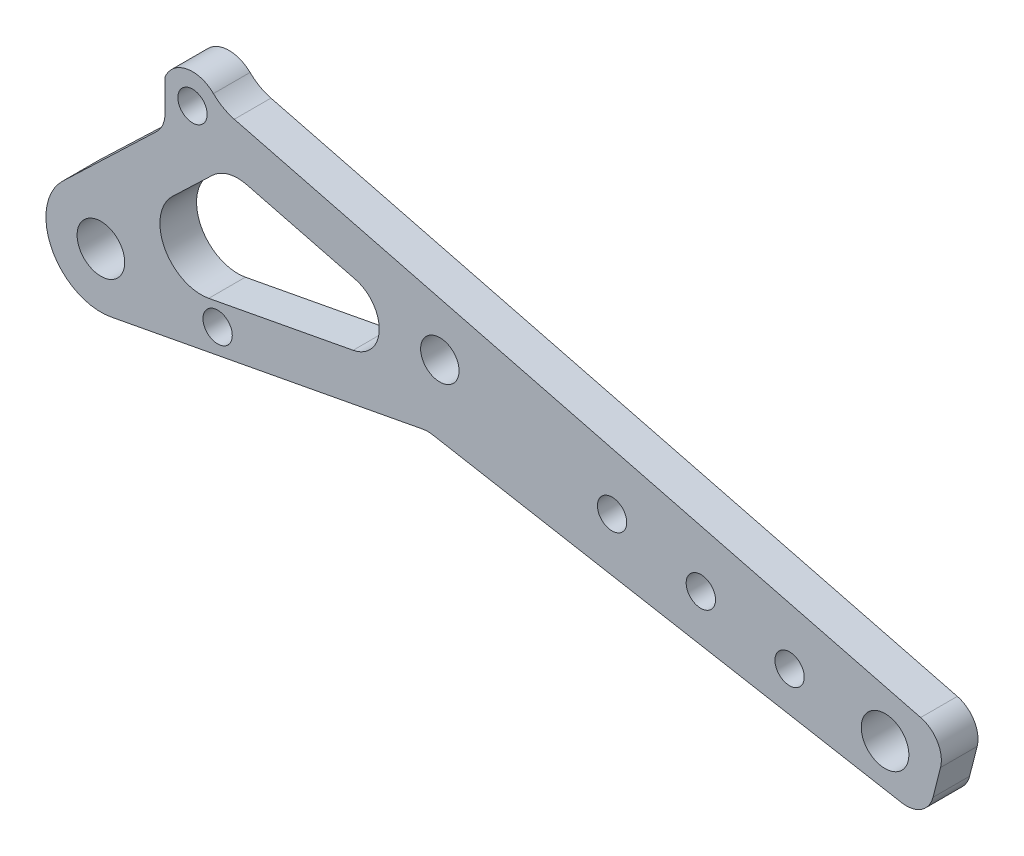
ISO-10303-21;
HEADER;
FILE_DESCRIPTION(('STEP AP214'),'2;1');
FILE_NAME('part.step','',(''),(''),'','','');
FILE_SCHEMA(('AUTOMOTIVE_DESIGN { 1 0 10303 214 1 1 1 1 }'));
ENDSEC;
DATA;
#1=APPLICATION_CONTEXT('core data for automotive mechanical design processes');
#2=APPLICATION_PROTOCOL_DEFINITION('international standard','automotive_design',2000,#1);
#3=PRODUCT_CONTEXT('',#1,'mechanical');
#4=PRODUCT('Part','Part','',(#3));
#5=PRODUCT_RELATED_PRODUCT_CATEGORY('part','',(#4));
#6=PRODUCT_DEFINITION_FORMATION('','',#4);
#7=PRODUCT_DEFINITION_CONTEXT('part definition',#1,'design');
#8=PRODUCT_DEFINITION('design','',#6,#7);
#9=PRODUCT_DEFINITION_SHAPE('','',#8);
#10=(LENGTH_UNIT() NAMED_UNIT(*) SI_UNIT(.MILLI.,.METRE.));
#11=(NAMED_UNIT(*) PLANE_ANGLE_UNIT() SI_UNIT($,.RADIAN.));
#12=(NAMED_UNIT(*) SI_UNIT($,.STERADIAN.) SOLID_ANGLE_UNIT());
#13=UNCERTAINTY_MEASURE_WITH_UNIT(LENGTH_MEASURE(1.E-05),#10,'distance_accuracy_value','');
#14=(GEOMETRIC_REPRESENTATION_CONTEXT(3) GLOBAL_UNCERTAINTY_ASSIGNED_CONTEXT((#13)) GLOBAL_UNIT_ASSIGNED_CONTEXT((#10,
#11,#12)) REPRESENTATION_CONTEXT('',''));
#15=CARTESIAN_POINT('',(0.,0.,0.));
#16=DIRECTION('',(0.,0.,1.));
#17=DIRECTION('',(1.,0.,0.));
#18=AXIS2_PLACEMENT_3D('',#15,#16,#17);
#19=CARTESIAN_POINT('',(0.,0.,4.));
#20=DIRECTION('',(0.,0.,1.));
#21=DIRECTION('',(1.,0.,0.));
#22=AXIS2_PLACEMENT_3D('',#19,#20,#21);
#23=PLANE('',#22);
#24=CARTESIAN_POINT('',(-24.2579290742876,-9.0246929471557,4.));
#25=DIRECTION('',(0.,0.,1.));
#26=DIRECTION('',(1.,0.,0.));
#27=AXIS2_PLACEMENT_3D('',#24,#25,#26);
#28=CIRCLE('',#27,1.6);
#29=CARTESIAN_POINT('',(-22.6579290742876,-9.0246929471557,4.));
#30=VERTEX_POINT('',#29);
#31=EDGE_CURVE('E697',#30,#30,#28,.T.);
#32=ORIENTED_EDGE('',*,*,#31,.F.);
#33=EDGE_LOOP('',(#32));
#34=FACE_BOUND('',#33,.T.);
#35=CARTESIAN_POINT('',(48.605919829375,-11.7412498607445,4.));
#36=DIRECTION('',(0.,0.,1.));
#37=DIRECTION('',(1.,0.,0.));
#38=AXIS2_PLACEMENT_3D('',#35,#36,#37);
#39=CIRCLE('',#38,2.6);
#40=CARTESIAN_POINT('',(51.205919829375,-11.7412498607445,4.));
#41=VERTEX_POINT('',#40);
#42=EDGE_CURVE('E206',#41,#41,#39,.T.);
#43=ORIENTED_EDGE('',*,*,#42,.F.);
#44=EDGE_LOOP('',(#43));
#45=FACE_BOUND('',#44,.T.);
#46=CARTESIAN_POINT('',(-10.1109774104164,-0.388566041352794,4.));
#47=DIRECTION('',(0.,0.,-1.));
#48=DIRECTION('',(1.,0.,0.));
#49=AXIS2_PLACEMENT_3D('',#46,#47,#48);
#50=CIRCLE('',#49,3.5);
#51=CARTESIAN_POINT('',(-9.24659939315065,3.0030192285863,4.));
#52=VERTEX_POINT('',#51);
#53=CARTESIAN_POINT('',(-9.46278783560658,-3.82802098001792,4.));
#54=VERTEX_POINT('',#53);
#55=EDGE_CURVE('E180',#52,#54,#50,.T.);
#56=ORIENTED_EDGE('',*,*,#55,.T.);
#57=DIRECTION('',(-0.982701411047179,-0.185197021374221,0.));
#58=VECTOR('',#57,1.);
#59=CARTESIAN_POINT('',(-9.46278783560658,-3.82802098001792,4.));
#60=LINE('',#59,#58);
#61=CARTESIAN_POINT('',(-25.2250618145575,-6.79853283455515,4.));
#62=VERTEX_POINT('',#61);
#63=EDGE_CURVE('E192',#54,#62,#60,.T.);
#64=ORIENTED_EDGE('',*,*,#63,.T.);
#65=CARTESIAN_POINT('',(-26.0584484107415,-2.37637648484284,4.));
#66=DIRECTION('',(0.,0.,-1.));
#67=DIRECTION('',(1.,0.,0.));
#68=AXIS2_PLACEMENT_3D('',#65,#66,#67);
#69=CIRCLE('',#68,4.5);
#70=CARTESIAN_POINT('',(-29.1691757168968,0.875296258029632,4.));
#71=VERTEX_POINT('',#70);
#72=EDGE_CURVE('E196',#62,#71,#69,.T.);
#73=ORIENTED_EDGE('',*,*,#72,.T.);
#74=DIRECTION('',(0.72259394286055,0.691272734701177,0.));
#75=VECTOR('',#74,1.);
#76=CARTESIAN_POINT('',(-24.8250370023878,5.03113603328696,4.));
#77=LINE('',#76,#75);
#78=CARTESIAN_POINT('',(-24.8250370023878,5.03113603328696,4.));
#79=VERTEX_POINT('',#78);
#80=EDGE_CURVE('E210',#71,#79,#77,.T.);
#81=ORIENTED_EDGE('',*,*,#80,.T.);
#82=CARTESIAN_POINT('',(-22.0599460635831,2.14076026184476,4.));
#83=DIRECTION('',(0.,0.,-1.));
#84=DIRECTION('',(-1.,0.,0.));
#85=AXIS2_PLACEMENT_3D('',#82,#83,#84);
#86=CIRCLE('',#85,4.);
#87=CARTESIAN_POINT('',(-21.0720854724223,6.01685771320372,4.));
#88=VERTEX_POINT('',#87);
#89=EDGE_CURVE('E213',#79,#88,#86,.T.);
#90=ORIENTED_EDGE('',*,*,#89,.T.);
#91=DIRECTION('',(0.96902436283974,-0.2469651477902,0.));
#92=VECTOR('',#91,1.);
#93=CARTESIAN_POINT('',(-9.24659939315065,3.0030192285863,4.));
#94=LINE('',#93,#92);
#95=EDGE_CURVE('E188',#88,#52,#94,.T.);
#96=ORIENTED_EDGE('',*,*,#95,.T.);
#97=EDGE_LOOP('',(#56,#64,#73,#81,#90,#96));
#98=FACE_BOUND('',#97,.T.);
#99=DIRECTION('',(0.984295601925326,-0.176528094167641,0.));
#100=VECTOR('',#99,1.);
#101=CARTESIAN_POINT('',(-1.32396070625731,-7.38221701443995,4.));
#102=LINE('',#101,#100);
#103=CARTESIAN_POINT('',(-0.780933282241435,-7.47960604681475,4.));
#104=VERTEX_POINT('',#103);
#105=CARTESIAN_POINT('',(50.3998489295503,-16.65860260454,4.));
#106=VERTEX_POINT('',#105);
#107=EDGE_CURVE('E321',#104,#106,#102,.T.);
#108=ORIENTED_EDGE('',*,*,#107,.T.);
#109=CARTESIAN_POINT('',(50.9294332120532,-13.7057157987641,4.));
#110=DIRECTION('',(0.,0.,1.));
#111=DIRECTION('',(1.,0.,0.));
#112=AXIS2_PLACEMENT_3D('',#109,#110,#111);
#113=CIRCLE('',#112,3.);
#114=CARTESIAN_POINT('',(53.8365063005724,-14.4466112421347,4.));
#115=VERTEX_POINT('',#114);
#116=EDGE_CURVE('E50',#106,#115,#113,.T.);
#117=ORIENTED_EDGE('',*,*,#116,.T.);
#118=DIRECTION('',(-0.2469651477902,-0.969024362839741,0.));
#119=VECTOR('',#118,1.);
#120=CARTESIAN_POINT('',(55.7701911815471,-6.85935540265431,4.));
#121=LINE('',#120,#119);
#122=CARTESIAN_POINT('',(54.6588480164912,-11.2199650354331,4.));
#123=VERTEX_POINT('',#122);
#124=EDGE_CURVE('E271',#123,#115,#121,.T.);
#125=ORIENTED_EDGE('',*,*,#124,.F.);
#126=CARTESIAN_POINT('',(51.751774927972,-10.4790695920625,4.));
#127=DIRECTION('',(0.,0.,1.));
#128=DIRECTION('',(1.,0.,0.));
#129=AXIS2_PLACEMENT_3D('',#126,#127,#128);
#130=CIRCLE('',#129,3.);
#131=CARTESIAN_POINT('',(52.4926703713426,-7.57199650354331,4.));
#132=VERTEX_POINT('',#131);
#133=EDGE_CURVE('E57',#123,#132,#130,.T.);
#134=ORIENTED_EDGE('',*,*,#133,.T.);
#135=DIRECTION('',(-0.96902436283974,0.2469651477902,0.));
#136=VECTOR('',#135,1.);
#137=CARTESIAN_POINT('',(59.9786379551097,-9.47986710161563,4.));
#138=LINE('',#137,#136);
#139=CARTESIAN_POINT('',(-22.4376172210398,11.5247055597415,4.));
#140=VERTEX_POINT('',#139);
#141=EDGE_CURVE('E240',#132,#140,#138,.T.);
#142=ORIENTED_EDGE('',*,*,#141,.T.);
#143=CARTESIAN_POINT('',(-21.2027914820888,16.3698273739402,4.));
#144=DIRECTION('',(0.,0.,-1.));
#145=DIRECTION('',(-1.,0.,0.));
#146=AXIS2_PLACEMENT_3D('',#143,#144,#145);
#147=CIRCLE('',#146,5.);
#148=CARTESIAN_POINT('',(-24.7162511899138,12.8123562382189,4.));
#149=VERTEX_POINT('',#148);
#150=EDGE_CURVE('E237',#140,#149,#147,.T.);
#151=ORIENTED_EDGE('',*,*,#150,.T.);
#152=CARTESIAN_POINT('',(-27.,10.5,4.));
#153=DIRECTION('',(0.,0.,-1.));
#154=DIRECTION('',(1.,0.,0.));
#155=AXIS2_PLACEMENT_3D('',#152,#153,#154);
#156=CIRCLE('',#155,3.25);
#157=CARTESIAN_POINT('',(-30.,11.75,4.));
#158=VERTEX_POINT('',#157);
#159=EDGE_CURVE('E300',#158,#149,#156,.T.);
#160=ORIENTED_EDGE('',*,*,#159,.F.);
#161=DIRECTION('',(0.,-1.,0.));
#162=VECTOR('',#161,1.);
#163=CARTESIAN_POINT('',(-30.,15.,4.));
#164=LINE('',#163,#162);
#165=CARTESIAN_POINT('',(-30.,8.28174586162454,4.));
#166=VERTEX_POINT('',#165);
#167=EDGE_CURVE('E319',#158,#166,#164,.T.);
#168=ORIENTED_EDGE('',*,*,#167,.T.);
#169=CARTESIAN_POINT('',(-33.,8.28174586162454,4.));
#170=DIRECTION('',(0.,0.,1.));
#171=DIRECTION('',(1.,0.,0.));
#172=AXIS2_PLACEMENT_3D('',#169,#170,#171);
#173=CIRCLE('',#172,3.);
#174=CARTESIAN_POINT('',(-30.9261817958965,6.11396403304289,4.));
#175=VERTEX_POINT('',#174);
#176=EDGE_CURVE('E343',#166,#175,#173,.F.);
#177=ORIENTED_EDGE('',*,*,#176,.T.);
#178=DIRECTION('',(-0.72259394286055,-0.691272734701178,0.));
#179=VECTOR('',#178,1.);
#180=CARTESIAN_POINT('',(-17.8323062489554,18.6402787726028,4.));
#181=LINE('',#180,#179);
#182=CARTESIAN_POINT('',(-41.1476364082071,-3.6644363428367,4.));
#183=VERTEX_POINT('',#182);
#184=EDGE_CURVE('E291',#175,#183,#181,.T.);
#185=ORIENTED_EDGE('',*,*,#184,.T.);
#186=CARTESIAN_POINT('',(-37.,-8.,4.));
#187=DIRECTION('',(0.,0.,1.));
#188=DIRECTION('',(1.,0.,0.));
#189=AXIS2_PLACEMENT_3D('',#186,#187,#188);
#190=CIRCLE('',#189,6.);
#191=CARTESIAN_POINT('',(-35.8888178717547,-13.8962084662831,4.));
#192=VERTEX_POINT('',#191);
#193=EDGE_CURVE('E293',#183,#192,#190,.T.);
#194=ORIENTED_EDGE('',*,*,#193,.T.);
#195=DIRECTION('',(-0.982701411047179,-0.185197021374221,0.));
#196=VECTOR('',#195,1.);
#197=CARTESIAN_POINT('',(1.29810546319708,-6.8880701261073,4.));
#198=LINE('',#197,#196);
#199=CARTESIAN_POINT('',(-1.86610862886702,-7.4843886194492,4.));
#200=VERTEX_POINT('',#199);
#201=EDGE_CURVE('E281',#200,#192,#198,.T.);
#202=ORIENTED_EDGE('',*,*,#201,.F.);
#203=CARTESIAN_POINT('',(-1.31051756474436,-10.4324928525907,4.));
#204=DIRECTION('',(0.,0.,1.));
#205=DIRECTION('',(1.,0.,0.));
#206=AXIS2_PLACEMENT_3D('',#203,#204,#205);
#207=CIRCLE('',#206,3.);
#208=EDGE_CURVE('E341',#200,#104,#207,.F.);
#209=ORIENTED_EDGE('',*,*,#208,.T.);
#210=EDGE_LOOP('',(#108,#117,#125,#134,#142,#151,#160,#168,#177,#185,#194,#202,#209));
#211=FACE_BOUND('',#210,.T.);
#212=CARTESIAN_POINT('',(-37.,-8.,4.));
#213=DIRECTION('',(0.,0.,1.));
#214=DIRECTION('',(1.,0.,0.));
#215=AXIS2_PLACEMENT_3D('',#212,#213,#214);
#216=CIRCLE('',#215,2.6);
#217=CARTESIAN_POINT('',(-34.4,-8.,4.));
#218=VERTEX_POINT('',#217);
#219=EDGE_CURVE('E274',#218,#218,#216,.T.);
#220=ORIENTED_EDGE('',*,*,#219,.F.);
#221=EDGE_LOOP('',(#220));
#222=FACE_BOUND('',#221,.T.);
#223=CARTESIAN_POINT('',(0.,0.,4.));
#224=DIRECTION('',(0.,0.,1.));
#225=DIRECTION('',(1.,0.,0.));
#226=AXIS2_PLACEMENT_3D('',#223,#224,#225);
#227=CIRCLE('',#226,2.1);
#228=CARTESIAN_POINT('',(2.1,0.,4.));
#229=VERTEX_POINT('',#228);
#230=EDGE_CURVE('E313',#229,#229,#227,.T.);
#231=ORIENTED_EDGE('',*,*,#230,.F.);
#232=EDGE_LOOP('',(#231));
#233=FACE_BOUND('',#232,.T.);
#234=CARTESIAN_POINT('',(28.4939552433701,-7.64748869388513,4.));
#235=DIRECTION('',(0.,0.,-1.));
#236=DIRECTION('',(-1.,0.,0.));
#237=AXIS2_PLACEMENT_3D('',#234,#235,#236);
#238=CIRCLE('',#237,1.6);
#239=CARTESIAN_POINT('',(26.8939552433701,-7.64748869388513,4.));
#240=VERTEX_POINT('',#239);
#241=EDGE_CURVE('E266',#240,#240,#238,.T.);
#242=ORIENTED_EDGE('',*,*,#241,.T.);
#243=EDGE_LOOP('',(#242));
#244=FACE_BOUND('',#243,.T.);
#245=CARTESIAN_POINT('',(18.8037116149727,-5.17783721598313,4.));
#246=DIRECTION('',(0.,0.,-1.));
#247=DIRECTION('',(-1.,0.,0.));
#248=AXIS2_PLACEMENT_3D('',#245,#246,#247);
#249=CIRCLE('',#248,1.6);
#250=CARTESIAN_POINT('',(17.2037116149727,-5.17783721598313,4.));
#251=VERTEX_POINT('',#250);
#252=EDGE_CURVE('E260',#251,#251,#249,.T.);
#253=ORIENTED_EDGE('',*,*,#252,.T.);
#254=EDGE_LOOP('',(#253));
#255=FACE_BOUND('',#254,.T.);
#256=CARTESIAN_POINT('',(38.1841988717675,-10.1171401717871,4.));
#257=DIRECTION('',(0.,0.,-1.));
#258=DIRECTION('',(-1.,0.,0.));
#259=AXIS2_PLACEMENT_3D('',#256,#257,#258);
#260=CIRCLE('',#259,1.6);
#261=CARTESIAN_POINT('',(36.5841988717675,-10.1171401717871,4.));
#262=VERTEX_POINT('',#261);
#263=EDGE_CURVE('E253',#262,#262,#260,.T.);
#264=ORIENTED_EDGE('',*,*,#263,.T.);
#265=EDGE_LOOP('',(#264));
#266=FACE_BOUND('',#265,.T.);
#267=CARTESIAN_POINT('',(-27.,10.5,4.));
#268=DIRECTION('',(0.,0.,1.));
#269=DIRECTION('',(1.,0.,0.));
#270=AXIS2_PLACEMENT_3D('',#267,#268,#269);
#271=CIRCLE('',#270,1.6);
#272=CARTESIAN_POINT('',(-25.4,10.5,4.));
#273=VERTEX_POINT('',#272);
#274=EDGE_CURVE('E305',#273,#273,#271,.T.);
#275=ORIENTED_EDGE('',*,*,#274,.F.);
#276=EDGE_LOOP('',(#275));
#277=FACE_BOUND('',#276,.T.);
#278=ADVANCED_FACE('F41',(#34,#45,#98,#211,#222,#233,#244,#255,#266,#277),#23,.T.);
#279=CARTESIAN_POINT('',(0.,0.,0.));
#280=DIRECTION('',(0.,0.,1.));
#281=DIRECTION('',(1.,0.,0.));
#282=AXIS2_PLACEMENT_3D('',#279,#280,#281);
#283=PLANE('',#282);
#284=CARTESIAN_POINT('',(-24.2579290742876,-9.0246929471557,0.));
#285=DIRECTION('',(0.,0.,1.));
#286=DIRECTION('',(1.,0.,0.));
#287=AXIS2_PLACEMENT_3D('',#284,#285,#286);
#288=CIRCLE('',#287,1.6);
#289=CARTESIAN_POINT('',(-22.6579290742876,-9.0246929471557,0.));
#290=VERTEX_POINT('',#289);
#291=EDGE_CURVE('E45',#290,#290,#288,.T.);
#292=ORIENTED_EDGE('',*,*,#291,.T.);
#293=EDGE_LOOP('',(#292));
#294=FACE_BOUND('',#293,.T.);
#295=CARTESIAN_POINT('',(48.605919829375,-11.7412498607445,0.));
#296=DIRECTION('',(0.,0.,-1.));
#297=DIRECTION('',(-1.,0.,0.));
#298=AXIS2_PLACEMENT_3D('',#295,#296,#297);
#299=CIRCLE('',#298,2.6);
#300=CARTESIAN_POINT('',(46.005919829375,-11.7412498607445,0.));
#301=VERTEX_POINT('',#300);
#302=EDGE_CURVE('E700',#301,#301,#299,.T.);
#303=ORIENTED_EDGE('',*,*,#302,.F.);
#304=EDGE_LOOP('',(#303));
#305=FACE_BOUND('',#304,.T.);
#306=DIRECTION('',(-0.982701411047179,-0.185197021374221,0.));
#307=VECTOR('',#306,1.);
#308=CARTESIAN_POINT('',(-9.46278783560658,-3.82802098001792,0.));
#309=LINE('',#308,#307);
#310=CARTESIAN_POINT('',(-9.46278783560658,-3.82802098001792,0.));
#311=VERTEX_POINT('',#310);
#312=CARTESIAN_POINT('',(-25.2250618145575,-6.79853283455514,0.));
#313=VERTEX_POINT('',#312);
#314=EDGE_CURVE('E217',#311,#313,#309,.T.);
#315=ORIENTED_EDGE('',*,*,#314,.F.);
#316=CARTESIAN_POINT('',(-10.1109774104164,-0.388566041352794,0.));
#317=DIRECTION('',(0.,0.,-1.));
#318=DIRECTION('',(1.,0.,0.));
#319=AXIS2_PLACEMENT_3D('',#316,#317,#318);
#320=CIRCLE('',#319,3.5);
#321=CARTESIAN_POINT('',(-9.24659939315065,3.0030192285863,0.));
#322=VERTEX_POINT('',#321);
#323=EDGE_CURVE('E183',#322,#311,#320,.T.);
#324=ORIENTED_EDGE('',*,*,#323,.F.);
#325=DIRECTION('',(0.96902436283974,-0.2469651477902,0.));
#326=VECTOR('',#325,1.);
#327=CARTESIAN_POINT('',(-9.24659939315065,3.0030192285863,0.));
#328=LINE('',#327,#326);
#329=CARTESIAN_POINT('',(-21.0720854724223,6.01685771320372,0.));
#330=VERTEX_POINT('',#329);
#331=EDGE_CURVE('E200',#330,#322,#328,.T.);
#332=ORIENTED_EDGE('',*,*,#331,.F.);
#333=CARTESIAN_POINT('',(-22.0599460635831,2.14076026184476,0.));
#334=DIRECTION('',(0.,0.,-1.));
#335=DIRECTION('',(-1.,0.,0.));
#336=AXIS2_PLACEMENT_3D('',#333,#334,#335);
#337=CIRCLE('',#336,4.);
#338=CARTESIAN_POINT('',(-24.8250370023878,5.03113603328696,0.));
#339=VERTEX_POINT('',#338);
#340=EDGE_CURVE('E203',#339,#330,#337,.T.);
#341=ORIENTED_EDGE('',*,*,#340,.F.);
#342=DIRECTION('',(0.72259394286055,0.691272734701177,0.));
#343=VECTOR('',#342,1.);
#344=CARTESIAN_POINT('',(-24.8250370023878,5.03113603328696,0.));
#345=LINE('',#344,#343);
#346=CARTESIAN_POINT('',(-29.1691757168968,0.875296258029632,0.));
#347=VERTEX_POINT('',#346);
#348=EDGE_CURVE('E222',#347,#339,#345,.T.);
#349=ORIENTED_EDGE('',*,*,#348,.F.);
#350=CARTESIAN_POINT('',(-26.0584484107415,-2.37637648484284,0.));
#351=DIRECTION('',(0.,0.,-1.));
#352=DIRECTION('',(1.,0.,0.));
#353=AXIS2_PLACEMENT_3D('',#350,#351,#352);
#354=CIRCLE('',#353,4.5);
#355=EDGE_CURVE('E219',#313,#347,#354,.T.);
#356=ORIENTED_EDGE('',*,*,#355,.F.);
#357=EDGE_LOOP('',(#315,#324,#332,#341,#349,#356));
#358=FACE_BOUND('',#357,.T.);
#359=CARTESIAN_POINT('',(38.1841988717675,-10.1171401717871,0.));
#360=DIRECTION('',(0.,0.,-1.));
#361=DIRECTION('',(-1.,0.,0.));
#362=AXIS2_PLACEMENT_3D('',#359,#360,#361);
#363=CIRCLE('',#362,1.6);
#364=CARTESIAN_POINT('',(36.5841988717675,-10.1171401717871,0.));
#365=VERTEX_POINT('',#364);
#366=EDGE_CURVE('E257',#365,#365,#363,.T.);
#367=ORIENTED_EDGE('',*,*,#366,.F.);
#368=EDGE_LOOP('',(#367));
#369=FACE_BOUND('',#368,.T.);
#370=CARTESIAN_POINT('',(18.8037116149727,-5.17783721598313,0.));
#371=DIRECTION('',(0.,0.,-1.));
#372=DIRECTION('',(-1.,0.,0.));
#373=AXIS2_PLACEMENT_3D('',#370,#371,#372);
#374=CIRCLE('',#373,1.6);
#375=CARTESIAN_POINT('',(17.2037116149727,-5.17783721598313,0.));
#376=VERTEX_POINT('',#375);
#377=EDGE_CURVE('E263',#376,#376,#374,.T.);
#378=ORIENTED_EDGE('',*,*,#377,.F.);
#379=EDGE_LOOP('',(#378));
#380=FACE_BOUND('',#379,.T.);
#381=CARTESIAN_POINT('',(28.4939552433701,-7.64748869388513,0.));
#382=DIRECTION('',(0.,0.,-1.));
#383=DIRECTION('',(-1.,0.,0.));
#384=AXIS2_PLACEMENT_3D('',#381,#382,#383);
#385=CIRCLE('',#384,1.6);
#386=CARTESIAN_POINT('',(26.8939552433701,-7.64748869388513,0.));
#387=VERTEX_POINT('',#386);
#388=EDGE_CURVE('E250',#387,#387,#385,.T.);
#389=ORIENTED_EDGE('',*,*,#388,.F.);
#390=EDGE_LOOP('',(#389));
#391=FACE_BOUND('',#390,.T.);
#392=CARTESIAN_POINT('',(0.,0.,0.));
#393=DIRECTION('',(0.,0.,1.));
#394=DIRECTION('',(1.,0.,0.));
#395=AXIS2_PLACEMENT_3D('',#392,#393,#394);
#396=CIRCLE('',#395,2.1);
#397=CARTESIAN_POINT('',(2.1,0.,0.));
#398=VERTEX_POINT('',#397);
#399=EDGE_CURVE('E310',#398,#398,#396,.T.);
#400=ORIENTED_EDGE('',*,*,#399,.T.);
#401=EDGE_LOOP('',(#400));
#402=FACE_BOUND('',#401,.T.);
#403=CARTESIAN_POINT('',(-37.,-8.,0.));
#404=DIRECTION('',(0.,0.,1.));
#405=DIRECTION('',(1.,0.,0.));
#406=AXIS2_PLACEMENT_3D('',#403,#404,#405);
#407=CIRCLE('',#406,2.6);
#408=CARTESIAN_POINT('',(-34.4,-8.,0.));
#409=VERTEX_POINT('',#408);
#410=EDGE_CURVE('E277',#409,#409,#407,.T.);
#411=ORIENTED_EDGE('',*,*,#410,.T.);
#412=EDGE_LOOP('',(#411));
#413=FACE_BOUND('',#412,.T.);
#414=DIRECTION('',(-0.2469651477902,-0.969024362839741,0.));
#415=VECTOR('',#414,1.);
#416=CARTESIAN_POINT('',(55.7701911815471,-6.85935540265431,0.));
#417=LINE('',#416,#415);
#418=CARTESIAN_POINT('',(54.6588480164912,-11.2199650354331,0.));
#419=VERTEX_POINT('',#418);
#420=CARTESIAN_POINT('',(53.8365063005724,-14.4466112421347,0.));
#421=VERTEX_POINT('',#420);
#422=EDGE_CURVE('E256',#419,#421,#417,.T.);
#423=ORIENTED_EDGE('',*,*,#422,.T.);
#424=CARTESIAN_POINT('',(50.9294332120532,-13.7057157987641,0.));
#425=DIRECTION('',(0.,0.,1.));
#426=DIRECTION('',(1.,0.,0.));
#427=AXIS2_PLACEMENT_3D('',#424,#425,#426);
#428=CIRCLE('',#427,3.);
#429=CARTESIAN_POINT('',(50.3998489295503,-16.65860260454,0.));
#430=VERTEX_POINT('',#429);
#431=EDGE_CURVE('E355',#421,#430,#428,.F.);
#432=ORIENTED_EDGE('',*,*,#431,.T.);
#433=DIRECTION('',(0.984295601925326,-0.176528094167641,0.));
#434=VECTOR('',#433,1.);
#435=CARTESIAN_POINT('',(-1.32396070625731,-7.38221701443995,0.));
#436=LINE('',#435,#434);
#437=CARTESIAN_POINT('',(-0.780933282241435,-7.47960604681475,0.));
#438=VERTEX_POINT('',#437);
#439=EDGE_CURVE('E322',#438,#430,#436,.T.);
#440=ORIENTED_EDGE('',*,*,#439,.F.);
#441=CARTESIAN_POINT('',(-1.31051756474436,-10.4324928525907,0.));
#442=DIRECTION('',(0.,0.,1.));
#443=DIRECTION('',(1.,0.,0.));
#444=AXIS2_PLACEMENT_3D('',#441,#442,#443);
#445=CIRCLE('',#444,3.);
#446=CARTESIAN_POINT('',(-1.86610862886702,-7.4843886194492,0.));
#447=VERTEX_POINT('',#446);
#448=EDGE_CURVE('E339',#438,#447,#445,.T.);
#449=ORIENTED_EDGE('',*,*,#448,.T.);
#450=DIRECTION('',(-0.982701411047179,-0.185197021374221,0.));
#451=VECTOR('',#450,1.);
#452=CARTESIAN_POINT('',(1.29810546319708,-6.8880701261073,0.));
#453=LINE('',#452,#451);
#454=CARTESIAN_POINT('',(-35.8888178717547,-13.8962084662831,0.));
#455=VERTEX_POINT('',#454);
#456=EDGE_CURVE('E286',#447,#455,#453,.T.);
#457=ORIENTED_EDGE('',*,*,#456,.T.);
#458=CARTESIAN_POINT('',(-37.,-8.,0.));
#459=DIRECTION('',(0.,0.,1.));
#460=DIRECTION('',(1.,0.,0.));
#461=AXIS2_PLACEMENT_3D('',#458,#459,#460);
#462=CIRCLE('',#461,6.);
#463=CARTESIAN_POINT('',(-41.1476364082071,-3.6644363428367,0.));
#464=VERTEX_POINT('',#463);
#465=EDGE_CURVE('E283',#464,#455,#462,.T.);
#466=ORIENTED_EDGE('',*,*,#465,.F.);
#467=DIRECTION('',(-0.72259394286055,-0.691272734701178,0.));
#468=VECTOR('',#467,1.);
#469=CARTESIAN_POINT('',(-17.8323062489554,18.6402787726028,0.));
#470=LINE('',#469,#468);
#471=CARTESIAN_POINT('',(-30.9261817958965,6.11396403304289,0.));
#472=VERTEX_POINT('',#471);
#473=EDGE_CURVE('E280',#472,#464,#470,.T.);
#474=ORIENTED_EDGE('',*,*,#473,.F.);
#475=CARTESIAN_POINT('',(-33.,8.28174586162454,0.));
#476=DIRECTION('',(0.,0.,1.));
#477=DIRECTION('',(1.,0.,0.));
#478=AXIS2_PLACEMENT_3D('',#475,#476,#477);
#479=CIRCLE('',#478,3.);
#480=CARTESIAN_POINT('',(-30.,8.28174586162454,0.));
#481=VERTEX_POINT('',#480);
#482=EDGE_CURVE('E345',#472,#481,#479,.T.);
#483=ORIENTED_EDGE('',*,*,#482,.T.);
#484=DIRECTION('',(0.,-1.,0.));
#485=VECTOR('',#484,1.);
#486=CARTESIAN_POINT('',(-30.,15.,0.));
#487=LINE('',#486,#485);
#488=CARTESIAN_POINT('',(-30.,11.75,0.));
#489=VERTEX_POINT('',#488);
#490=EDGE_CURVE('E316',#489,#481,#487,.T.);
#491=ORIENTED_EDGE('',*,*,#490,.F.);
#492=CARTESIAN_POINT('',(-27.,10.5,0.));
#493=DIRECTION('',(0.,0.,-1.));
#494=DIRECTION('',(1.,0.,0.));
#495=AXIS2_PLACEMENT_3D('',#492,#493,#494);
#496=CIRCLE('',#495,3.25);
#497=CARTESIAN_POINT('',(-24.7162511899138,12.8123562382189,0.));
#498=VERTEX_POINT('',#497);
#499=EDGE_CURVE('E303',#489,#498,#496,.T.);
#500=ORIENTED_EDGE('',*,*,#499,.T.);
#501=CARTESIAN_POINT('',(-21.2027914820888,16.3698273739402,0.));
#502=DIRECTION('',(0.,0.,-1.));
#503=DIRECTION('',(-1.,0.,0.));
#504=AXIS2_PLACEMENT_3D('',#501,#502,#503);
#505=CIRCLE('',#504,5.);
#506=CARTESIAN_POINT('',(-22.4376172210398,11.5247055597415,0.));
#507=VERTEX_POINT('',#506);
#508=EDGE_CURVE('E229',#507,#498,#505,.T.);
#509=ORIENTED_EDGE('',*,*,#508,.F.);
#510=DIRECTION('',(-0.96902436283974,0.2469651477902,0.));
#511=VECTOR('',#510,1.);
#512=CARTESIAN_POINT('',(59.9786379551097,-9.47986710161563,0.));
#513=LINE('',#512,#511);
#514=CARTESIAN_POINT('',(52.4926703713426,-7.57199650354331,0.));
#515=VERTEX_POINT('',#514);
#516=EDGE_CURVE('E241',#515,#507,#513,.T.);
#517=ORIENTED_EDGE('',*,*,#516,.F.);
#518=CARTESIAN_POINT('',(51.751774927972,-10.4790695920625,0.));
#519=DIRECTION('',(0.,0.,1.));
#520=DIRECTION('',(1.,0.,0.));
#521=AXIS2_PLACEMENT_3D('',#518,#519,#520);
#522=CIRCLE('',#521,3.);
#523=EDGE_CURVE('E353',#515,#419,#522,.F.);
#524=ORIENTED_EDGE('',*,*,#523,.T.);
#525=EDGE_LOOP('',(#423,#432,#440,#449,#457,#466,#474,#483,#491,#500,#509,#517,#524));
#526=FACE_BOUND('',#525,.T.);
#527=CARTESIAN_POINT('',(-27.,10.5,0.));
#528=DIRECTION('',(0.,0.,1.));
#529=DIRECTION('',(1.,0.,0.));
#530=AXIS2_PLACEMENT_3D('',#527,#528,#529);
#531=CIRCLE('',#530,1.6);
#532=CARTESIAN_POINT('',(-25.4,10.5,0.));
#533=VERTEX_POINT('',#532);
#534=EDGE_CURVE('E307',#533,#533,#531,.T.);
#535=ORIENTED_EDGE('',*,*,#534,.T.);
#536=EDGE_LOOP('',(#535));
#537=FACE_BOUND('',#536,.T.);
#538=ADVANCED_FACE('F370',(#294,#305,#358,#369,#380,#391,#402,#413,#526,#537),#283,.F.);
#539=CARTESIAN_POINT('',(-30.,15.,4.));
#540=DIRECTION('',(1.,0.,0.));
#541=DIRECTION('',(0.,1.,0.));
#542=AXIS2_PLACEMENT_3D('',#539,#540,#541);
#543=PLANE('',#542);
#544=DIRECTION('',(0.,0.,1.));
#545=VECTOR('',#544,1.);
#546=CARTESIAN_POINT('',(-30.,8.28174586162454,4.));
#547=LINE('',#546,#545);
#548=EDGE_CURVE('E334',#481,#166,#547,.T.);
#549=ORIENTED_EDGE('',*,*,#548,.T.);
#550=ORIENTED_EDGE('',*,*,#167,.F.);
#551=DIRECTION('',(0.,0.,1.));
#552=VECTOR('',#551,1.);
#553=CARTESIAN_POINT('',(-30.,11.75,0.));
#554=LINE('',#553,#552);
#555=EDGE_CURVE('E324',#158,#489,#554,.F.);
#556=ORIENTED_EDGE('',*,*,#555,.T.);
#557=ORIENTED_EDGE('',*,*,#490,.T.);
#558=EDGE_LOOP('',(#549,#550,#556,#557));
#559=FACE_BOUND('',#558,.T.);
#560=ADVANCED_FACE('F399',(#559),#543,.F.);
#561=CARTESIAN_POINT('',(-1.32396070625731,-7.38221701443995,4.));
#562=DIRECTION('',(0.176528094167641,0.984295601925326,0.));
#563=DIRECTION('',(-0.984295601925326,0.176528094167641,0.));
#564=AXIS2_PLACEMENT_3D('',#561,#562,#563);
#565=PLANE('',#564);
#566=ORIENTED_EDGE('',*,*,#439,.T.);
#567=DIRECTION('',(0.,0.,-1.));
#568=VECTOR('',#567,1.);
#569=CARTESIAN_POINT('',(50.3998489295503,-16.65860260454,4.));
#570=LINE('',#569,#568);
#571=EDGE_CURVE('E65',#430,#106,#570,.F.);
#572=ORIENTED_EDGE('',*,*,#571,.T.);
#573=ORIENTED_EDGE('',*,*,#107,.F.);
#574=DIRECTION('',(0.,0.,-1.));
#575=VECTOR('',#574,1.);
#576=CARTESIAN_POINT('',(-0.780933282241435,-7.47960604681475,0.));
#577=LINE('',#576,#575);
#578=EDGE_CURVE('E329',#104,#438,#577,.T.);
#579=ORIENTED_EDGE('',*,*,#578,.T.);
#580=EDGE_LOOP('',(#566,#572,#573,#579));
#581=FACE_BOUND('',#580,.T.);
#582=ADVANCED_FACE('F372',(#581),#565,.F.);
#583=CARTESIAN_POINT('',(0.,0.,4.));
#584=DIRECTION('',(0.,0.,-1.));
#585=DIRECTION('',(-1.,0.,0.));
#586=AXIS2_PLACEMENT_3D('',#583,#584,#585);
#587=CYLINDRICAL_SURFACE('',#586,2.1);
#588=ORIENTED_EDGE('',*,*,#230,.T.);
#589=EDGE_LOOP('',(#588));
#590=FACE_BOUND('',#589,.T.);
#591=ORIENTED_EDGE('',*,*,#399,.F.);
#592=EDGE_LOOP('',(#591));
#593=FACE_BOUND('',#592,.T.);
#594=ADVANCED_FACE('F434',(#590,#593),#587,.F.);
#595=CARTESIAN_POINT('',(-27.,10.5,0.));
#596=DIRECTION('',(0.,0.,1.));
#597=DIRECTION('',(1.,0.,0.));
#598=AXIS2_PLACEMENT_3D('',#595,#596,#597);
#599=CYLINDRICAL_SURFACE('',#598,3.25);
#600=ORIENTED_EDGE('',*,*,#159,.T.);
#601=DIRECTION('',(0.,0.,-1.));
#602=VECTOR('',#601,1.);
#603=CARTESIAN_POINT('',(-24.7162511899138,12.8123562382189,4.));
#604=LINE('',#603,#602);
#605=EDGE_CURVE('E243',#149,#498,#604,.T.);
#606=ORIENTED_EDGE('',*,*,#605,.T.);
#607=ORIENTED_EDGE('',*,*,#499,.F.);
#608=ORIENTED_EDGE('',*,*,#555,.F.);
#609=EDGE_LOOP('',(#600,#606,#607,#608));
#610=FACE_BOUND('',#609,.T.);
#611=ADVANCED_FACE('F404',(#610),#599,.T.);
#612=CARTESIAN_POINT('',(-27.,10.5,0.));
#613=DIRECTION('',(0.,0.,1.));
#614=DIRECTION('',(1.,0.,0.));
#615=AXIS2_PLACEMENT_3D('',#612,#613,#614);
#616=CYLINDRICAL_SURFACE('',#615,1.6);
#617=ORIENTED_EDGE('',*,*,#534,.F.);
#618=EDGE_LOOP('',(#617));
#619=FACE_BOUND('',#618,.T.);
#620=ORIENTED_EDGE('',*,*,#274,.T.);
#621=EDGE_LOOP('',(#620));
#622=FACE_BOUND('',#621,.T.);
#623=ADVANCED_FACE('F465',(#619,#622),#616,.F.);
#624=CARTESIAN_POINT('',(-17.8323062489554,18.6402787726028,0.));
#625=DIRECTION('',(-0.691272734701178,0.72259394286055,0.));
#626=DIRECTION('',(-0.72259394286055,-0.691272734701178,0.));
#627=AXIS2_PLACEMENT_3D('',#624,#625,#626);
#628=PLANE('',#627);
#629=ORIENTED_EDGE('',*,*,#184,.F.);
#630=DIRECTION('',(0.,0.,1.));
#631=VECTOR('',#630,1.);
#632=CARTESIAN_POINT('',(-30.9261817958965,6.11396403304289,0.));
#633=LINE('',#632,#631);
#634=EDGE_CURVE('E337',#175,#472,#633,.F.);
#635=ORIENTED_EDGE('',*,*,#634,.T.);
#636=ORIENTED_EDGE('',*,*,#473,.T.);
#637=DIRECTION('',(0.,0.,1.));
#638=VECTOR('',#637,1.);
#639=CARTESIAN_POINT('',(-41.1476364082071,-3.6644363428367,0.));
#640=LINE('',#639,#638);
#641=EDGE_CURVE('E288',#464,#183,#640,.T.);
#642=ORIENTED_EDGE('',*,*,#641,.T.);
#643=EDGE_LOOP('',(#629,#635,#636,#642));
#644=FACE_BOUND('',#643,.T.);
#645=ADVANCED_FACE('F460',(#644),#628,.T.);
#646=CARTESIAN_POINT('',(1.29810546319708,-6.8880701261073,0.));
#647=DIRECTION('',(-0.185197021374221,0.982701411047179,0.));
#648=DIRECTION('',(-0.982701411047179,-0.185197021374221,0.));
#649=AXIS2_PLACEMENT_3D('',#646,#647,#648);
#650=PLANE('',#649);
#651=ORIENTED_EDGE('',*,*,#456,.F.);
#652=DIRECTION('',(0.,0.,-1.));
#653=VECTOR('',#652,1.);
#654=CARTESIAN_POINT('',(-1.86610862886702,-7.48438861944919,4.));
#655=LINE('',#654,#653);
#656=EDGE_CURVE('E332',#447,#200,#655,.F.);
#657=ORIENTED_EDGE('',*,*,#656,.T.);
#658=ORIENTED_EDGE('',*,*,#201,.T.);
#659=DIRECTION('',(0.,0.,1.));
#660=VECTOR('',#659,1.);
#661=CARTESIAN_POINT('',(-35.8888178717547,-13.8962084662831,0.));
#662=LINE('',#661,#660);
#663=EDGE_CURVE('E297',#455,#192,#662,.T.);
#664=ORIENTED_EDGE('',*,*,#663,.F.);
#665=EDGE_LOOP('',(#651,#657,#658,#664));
#666=FACE_BOUND('',#665,.T.);
#667=ADVANCED_FACE('F382',(#666),#650,.F.);
#668=CARTESIAN_POINT('',(-37.,-8.,0.));
#669=DIRECTION('',(0.,0.,1.));
#670=DIRECTION('',(1.,0.,0.));
#671=AXIS2_PLACEMENT_3D('',#668,#669,#670);
#672=CYLINDRICAL_SURFACE('',#671,2.6);
#673=ORIENTED_EDGE('',*,*,#410,.F.);
#674=EDGE_LOOP('',(#673));
#675=FACE_BOUND('',#674,.T.);
#676=ORIENTED_EDGE('',*,*,#219,.T.);
#677=EDGE_LOOP('',(#676));
#678=FACE_BOUND('',#677,.T.);
#679=ADVANCED_FACE('F459',(#675,#678),#672,.F.);
#680=CARTESIAN_POINT('',(-37.,-8.,0.));
#681=DIRECTION('',(0.,0.,1.));
#682=DIRECTION('',(1.,0.,0.));
#683=AXIS2_PLACEMENT_3D('',#680,#681,#682);
#684=CYLINDRICAL_SURFACE('',#683,6.);
#685=ORIENTED_EDGE('',*,*,#193,.F.);
#686=ORIENTED_EDGE('',*,*,#641,.F.);
#687=ORIENTED_EDGE('',*,*,#465,.T.);
#688=ORIENTED_EDGE('',*,*,#663,.T.);
#689=EDGE_LOOP('',(#685,#686,#687,#688));
#690=FACE_BOUND('',#689,.T.);
#691=ADVANCED_FACE('F387',(#690),#684,.T.);
#692=CARTESIAN_POINT('',(-1.31051756474436,-10.4324928525907,4.));
#693=DIRECTION('',(0.,0.,1.));
#694=DIRECTION('',(1.,0.,0.));
#695=AXIS2_PLACEMENT_3D('',#692,#693,#694);
#696=CYLINDRICAL_SURFACE('',#695,3.);
#697=ORIENTED_EDGE('',*,*,#208,.F.);
#698=ORIENTED_EDGE('',*,*,#656,.F.);
#699=ORIENTED_EDGE('',*,*,#448,.F.);
#700=ORIENTED_EDGE('',*,*,#578,.F.);
#701=EDGE_LOOP('',(#697,#698,#699,#700));
#702=FACE_BOUND('',#701,.T.);
#703=ADVANCED_FACE('F376',(#702),#696,.F.);
#704=CARTESIAN_POINT('',(-33.,8.28174586162454,4.));
#705=DIRECTION('',(0.,0.,1.));
#706=DIRECTION('',(1.,0.,0.));
#707=AXIS2_PLACEMENT_3D('',#704,#705,#706);
#708=CYLINDRICAL_SURFACE('',#707,3.);
#709=ORIENTED_EDGE('',*,*,#482,.F.);
#710=ORIENTED_EDGE('',*,*,#634,.F.);
#711=ORIENTED_EDGE('',*,*,#176,.F.);
#712=ORIENTED_EDGE('',*,*,#548,.F.);
#713=EDGE_LOOP('',(#709,#710,#711,#712));
#714=FACE_BOUND('',#713,.T.);
#715=ADVANCED_FACE('F395',(#714),#708,.F.);
#716=CARTESIAN_POINT('',(55.7701911815471,-6.85935540265431,4.));
#717=DIRECTION('',(0.96902436283974,-0.2469651477902,0.));
#718=DIRECTION('',(0.2469651477902,0.96902436283974,0.));
#719=AXIS2_PLACEMENT_3D('',#716,#717,#718);
#720=PLANE('',#719);
#721=ORIENTED_EDGE('',*,*,#124,.T.);
#722=DIRECTION('',(0.,0.,-1.));
#723=VECTOR('',#722,1.);
#724=CARTESIAN_POINT('',(53.8365063005724,-14.4466112421347,0.));
#725=LINE('',#724,#723);
#726=EDGE_CURVE('E350',#115,#421,#725,.T.);
#727=ORIENTED_EDGE('',*,*,#726,.T.);
#728=ORIENTED_EDGE('',*,*,#422,.F.);
#729=DIRECTION('',(0.,0.,-1.));
#730=VECTOR('',#729,1.);
#731=CARTESIAN_POINT('',(54.6588480164912,-11.2199650354331,4.));
#732=LINE('',#731,#730);
#733=EDGE_CURVE('E348',#419,#123,#732,.F.);
#734=ORIENTED_EDGE('',*,*,#733,.T.);
#735=EDGE_LOOP('',(#721,#727,#728,#734));
#736=FACE_BOUND('',#735,.T.);
#737=ADVANCED_FACE('F364',(#736),#720,.T.);
#738=CARTESIAN_POINT('',(28.4939552433701,-7.64748869388513,4.));
#739=DIRECTION('',(0.,0.,-1.));
#740=DIRECTION('',(-1.,0.,0.));
#741=AXIS2_PLACEMENT_3D('',#738,#739,#740);
#742=CYLINDRICAL_SURFACE('',#741,1.6);
#743=ORIENTED_EDGE('',*,*,#241,.F.);
#744=EDGE_LOOP('',(#743));
#745=FACE_BOUND('',#744,.T.);
#746=ORIENTED_EDGE('',*,*,#388,.T.);
#747=EDGE_LOOP('',(#746));
#748=FACE_BOUND('',#747,.T.);
#749=ADVANCED_FACE('F447',(#745,#748),#742,.F.);
#750=CARTESIAN_POINT('',(18.8037116149727,-5.17783721598313,4.));
#751=DIRECTION('',(0.,0.,-1.));
#752=DIRECTION('',(-1.,0.,0.));
#753=AXIS2_PLACEMENT_3D('',#750,#751,#752);
#754=CYLINDRICAL_SURFACE('',#753,1.6);
#755=ORIENTED_EDGE('',*,*,#252,.F.);
#756=EDGE_LOOP('',(#755));
#757=FACE_BOUND('',#756,.T.);
#758=ORIENTED_EDGE('',*,*,#377,.T.);
#759=EDGE_LOOP('',(#758));
#760=FACE_BOUND('',#759,.T.);
#761=ADVANCED_FACE('F452',(#757,#760),#754,.F.);
#762=CARTESIAN_POINT('',(38.1841988717675,-10.1171401717871,4.));
#763=DIRECTION('',(0.,0.,-1.));
#764=DIRECTION('',(-1.,0.,0.));
#765=AXIS2_PLACEMENT_3D('',#762,#763,#764);
#766=CYLINDRICAL_SURFACE('',#765,1.6);
#767=ORIENTED_EDGE('',*,*,#263,.F.);
#768=EDGE_LOOP('',(#767));
#769=FACE_BOUND('',#768,.T.);
#770=ORIENTED_EDGE('',*,*,#366,.T.);
#771=EDGE_LOOP('',(#770));
#772=FACE_BOUND('',#771,.T.);
#773=ADVANCED_FACE('F526',(#769,#772),#766,.F.);
#774=CARTESIAN_POINT('',(-21.2027914820888,16.3698273739402,4.));
#775=DIRECTION('',(0.,0.,-1.));
#776=DIRECTION('',(-1.,0.,0.));
#777=AXIS2_PLACEMENT_3D('',#774,#775,#776);
#778=CYLINDRICAL_SURFACE('',#777,5.);
#779=ORIENTED_EDGE('',*,*,#508,.T.);
#780=ORIENTED_EDGE('',*,*,#605,.F.);
#781=ORIENTED_EDGE('',*,*,#150,.F.);
#782=DIRECTION('',(0.,0.,-1.));
#783=VECTOR('',#782,1.);
#784=CARTESIAN_POINT('',(-22.4376172210398,11.5247055597415,4.));
#785=LINE('',#784,#783);
#786=EDGE_CURVE('E247',#140,#507,#785,.T.);
#787=ORIENTED_EDGE('',*,*,#786,.T.);
#788=EDGE_LOOP('',(#779,#780,#781,#787));
#789=FACE_BOUND('',#788,.T.);
#790=ADVANCED_FACE('F408',(#789),#778,.F.);
#791=CARTESIAN_POINT('',(59.9786379551097,-9.47986710161563,4.));
#792=DIRECTION('',(-0.2469651477902,-0.96902436283974,0.));
#793=DIRECTION('',(0.96902436283974,-0.2469651477902,0.));
#794=AXIS2_PLACEMENT_3D('',#791,#792,#793);
#795=PLANE('',#794);
#796=ORIENTED_EDGE('',*,*,#141,.F.);
#797=DIRECTION('',(0.,0.,-1.));
#798=VECTOR('',#797,1.);
#799=CARTESIAN_POINT('',(52.4926703713426,-7.57199650354331,0.));
#800=LINE('',#799,#798);
#801=EDGE_CURVE('E11',#132,#515,#800,.T.);
#802=ORIENTED_EDGE('',*,*,#801,.T.);
#803=ORIENTED_EDGE('',*,*,#516,.T.);
#804=ORIENTED_EDGE('',*,*,#786,.F.);
#805=EDGE_LOOP('',(#796,#802,#803,#804));
#806=FACE_BOUND('',#805,.T.);
#807=ADVANCED_FACE('F411',(#806),#795,.F.);
#808=CARTESIAN_POINT('',(-10.1109774104164,-0.388566041352794,4.));
#809=DIRECTION('',(0.,0.,-1.));
#810=DIRECTION('',(-1.,0.,0.));
#811=AXIS2_PLACEMENT_3D('',#808,#809,#810);
#812=CYLINDRICAL_SURFACE('',#811,3.5);
#813=ORIENTED_EDGE('',*,*,#323,.T.);
#814=DIRECTION('',(0.,0.,-1.));
#815=VECTOR('',#814,1.);
#816=CARTESIAN_POINT('',(-9.46278783560658,-3.82802098001792,4.));
#817=LINE('',#816,#815);
#818=EDGE_CURVE('E176',#54,#311,#817,.T.);
#819=ORIENTED_EDGE('',*,*,#818,.F.);
#820=ORIENTED_EDGE('',*,*,#55,.F.);
#821=DIRECTION('',(0.,0.,-1.));
#822=VECTOR('',#821,1.);
#823=CARTESIAN_POINT('',(-9.24659939315065,3.0030192285863,4.));
#824=LINE('',#823,#822);
#825=EDGE_CURVE('E227',#52,#322,#824,.T.);
#826=ORIENTED_EDGE('',*,*,#825,.T.);
#827=EDGE_LOOP('',(#813,#819,#820,#826));
#828=FACE_BOUND('',#827,.T.);
#829=ADVANCED_FACE('F178',(#828),#812,.F.);
#830=CARTESIAN_POINT('',(-9.24659939315065,3.0030192285863,4.));
#831=DIRECTION('',(0.2469651477902,0.96902436283974,0.));
#832=DIRECTION('',(-0.96902436283974,0.2469651477902,0.));
#833=AXIS2_PLACEMENT_3D('',#830,#831,#832);
#834=PLANE('',#833);
#835=ORIENTED_EDGE('',*,*,#331,.T.);
#836=ORIENTED_EDGE('',*,*,#825,.F.);
#837=ORIENTED_EDGE('',*,*,#95,.F.);
#838=DIRECTION('',(0.,0.,-1.));
#839=VECTOR('',#838,1.);
#840=CARTESIAN_POINT('',(-21.0720854724223,6.01685771320372,4.));
#841=LINE('',#840,#839);
#842=EDGE_CURVE('E230',#88,#330,#841,.T.);
#843=ORIENTED_EDGE('',*,*,#842,.T.);
#844=EDGE_LOOP('',(#835,#836,#837,#843));
#845=FACE_BOUND('',#844,.T.);
#846=ADVANCED_FACE('F571',(#845),#834,.F.);
#847=CARTESIAN_POINT('',(-22.0599460635831,2.14076026184476,4.));
#848=DIRECTION('',(0.,0.,-1.));
#849=DIRECTION('',(-1.,0.,0.));
#850=AXIS2_PLACEMENT_3D('',#847,#848,#849);
#851=CYLINDRICAL_SURFACE('',#850,4.);
#852=ORIENTED_EDGE('',*,*,#340,.T.);
#853=ORIENTED_EDGE('',*,*,#842,.F.);
#854=ORIENTED_EDGE('',*,*,#89,.F.);
#855=DIRECTION('',(0.,0.,-1.));
#856=VECTOR('',#855,1.);
#857=CARTESIAN_POINT('',(-24.8250370023878,5.03113603328696,4.));
#858=LINE('',#857,#856);
#859=EDGE_CURVE('E232',#79,#339,#858,.T.);
#860=ORIENTED_EDGE('',*,*,#859,.T.);
#861=EDGE_LOOP('',(#852,#853,#854,#860));
#862=FACE_BOUND('',#861,.T.);
#863=ADVANCED_FACE('F581',(#862),#851,.F.);
#864=CARTESIAN_POINT('',(-24.8250370023878,5.03113603328696,4.));
#865=DIRECTION('',(-0.691272734701177,0.72259394286055,0.));
#866=DIRECTION('',(-0.72259394286055,-0.691272734701177,0.));
#867=AXIS2_PLACEMENT_3D('',#864,#865,#866);
#868=PLANE('',#867);
#869=ORIENTED_EDGE('',*,*,#348,.T.);
#870=ORIENTED_EDGE('',*,*,#859,.F.);
#871=ORIENTED_EDGE('',*,*,#80,.F.);
#872=DIRECTION('',(0.,0.,-1.));
#873=VECTOR('',#872,1.);
#874=CARTESIAN_POINT('',(-29.1691757168968,0.875296258029632,4.));
#875=LINE('',#874,#873);
#876=EDGE_CURVE('E234',#71,#347,#875,.T.);
#877=ORIENTED_EDGE('',*,*,#876,.T.);
#878=EDGE_LOOP('',(#869,#870,#871,#877));
#879=FACE_BOUND('',#878,.T.);
#880=ADVANCED_FACE('F592',(#879),#868,.F.);
#881=CARTESIAN_POINT('',(-26.0584484107415,-2.37637648484284,4.));
#882=DIRECTION('',(0.,0.,-1.));
#883=DIRECTION('',(-1.,0.,0.));
#884=AXIS2_PLACEMENT_3D('',#881,#882,#883);
#885=CYLINDRICAL_SURFACE('',#884,4.5);
#886=ORIENTED_EDGE('',*,*,#355,.T.);
#887=ORIENTED_EDGE('',*,*,#876,.F.);
#888=ORIENTED_EDGE('',*,*,#72,.F.);
#889=DIRECTION('',(0.,0.,-1.));
#890=VECTOR('',#889,1.);
#891=CARTESIAN_POINT('',(-25.2250618145575,-6.79853283455514,4.));
#892=LINE('',#891,#890);
#893=EDGE_CURVE('E187',#62,#313,#892,.T.);
#894=ORIENTED_EDGE('',*,*,#893,.T.);
#895=EDGE_LOOP('',(#886,#887,#888,#894));
#896=FACE_BOUND('',#895,.T.);
#897=ADVANCED_FACE('F603',(#896),#885,.F.);
#898=CARTESIAN_POINT('',(-9.46278783560658,-3.82802098001792,4.));
#899=DIRECTION('',(0.185197021374221,-0.982701411047179,0.));
#900=DIRECTION('',(0.982701411047179,0.185197021374221,0.));
#901=AXIS2_PLACEMENT_3D('',#898,#899,#900);
#902=PLANE('',#901);
#903=ORIENTED_EDGE('',*,*,#314,.T.);
#904=ORIENTED_EDGE('',*,*,#893,.F.);
#905=ORIENTED_EDGE('',*,*,#63,.F.);
#906=ORIENTED_EDGE('',*,*,#818,.T.);
#907=EDGE_LOOP('',(#903,#904,#905,#906));
#908=FACE_BOUND('',#907,.T.);
#909=ADVANCED_FACE('F193',(#908),#902,.F.);
#910=CARTESIAN_POINT('',(50.9294332120532,-13.7057157987641,4.));
#911=DIRECTION('',(0.,0.,1.));
#912=DIRECTION('',(1.,0.,0.));
#913=AXIS2_PLACEMENT_3D('',#910,#911,#912);
#914=CYLINDRICAL_SURFACE('',#913,3.);
#915=ORIENTED_EDGE('',*,*,#116,.F.);
#916=ORIENTED_EDGE('',*,*,#571,.F.);
#917=ORIENTED_EDGE('',*,*,#431,.F.);
#918=ORIENTED_EDGE('',*,*,#726,.F.);
#919=EDGE_LOOP('',(#915,#916,#917,#918));
#920=FACE_BOUND('',#919,.T.);
#921=ADVANCED_FACE('F367',(#920),#914,.T.);
#922=CARTESIAN_POINT('',(51.751774927972,-10.4790695920625,4.));
#923=DIRECTION('',(0.,0.,1.));
#924=DIRECTION('',(1.,0.,0.));
#925=AXIS2_PLACEMENT_3D('',#922,#923,#924);
#926=CYLINDRICAL_SURFACE('',#925,3.);
#927=ORIENTED_EDGE('',*,*,#133,.F.);
#928=ORIENTED_EDGE('',*,*,#733,.F.);
#929=ORIENTED_EDGE('',*,*,#523,.F.);
#930=ORIENTED_EDGE('',*,*,#801,.F.);
#931=EDGE_LOOP('',(#927,#928,#929,#930));
#932=FACE_BOUND('',#931,.T.);
#933=ADVANCED_FACE('F43',(#932),#926,.T.);
#934=CARTESIAN_POINT('',(48.605919829375,-11.7412498607445,10.));
#935=DIRECTION('',(0.,0.,-1.));
#936=DIRECTION('',(-1.,0.,0.));
#937=AXIS2_PLACEMENT_3D('',#934,#935,#936);
#938=CYLINDRICAL_SURFACE('',#937,2.6);
#939=ORIENTED_EDGE('',*,*,#42,.T.);
#940=EDGE_LOOP('',(#939));
#941=FACE_BOUND('',#940,.T.);
#942=ORIENTED_EDGE('',*,*,#302,.T.);
#943=EDGE_LOOP('',(#942));
#944=FACE_BOUND('',#943,.T.);
#945=ADVANCED_FACE('F415',(#941,#944),#938,.F.);
#946=CARTESIAN_POINT('',(-24.2579290742876,-9.0246929471557,-6.));
#947=DIRECTION('',(0.,0.,1.));
#948=DIRECTION('',(1.,0.,0.));
#949=AXIS2_PLACEMENT_3D('',#946,#947,#948);
#950=CYLINDRICAL_SURFACE('',#949,1.6);
#951=ORIENTED_EDGE('',*,*,#31,.T.);
#952=EDGE_LOOP('',(#951));
#953=FACE_BOUND('',#952,.T.);
#954=ORIENTED_EDGE('',*,*,#291,.F.);
#955=EDGE_LOOP('',(#954));
#956=FACE_BOUND('',#955,.T.);
#957=ADVANCED_FACE('F420',(#953,#956),#950,.F.);
#958=CLOSED_SHELL('',(#278,#538,#560,#582,#594,#611,#623,#645,#667,#679,#691,#703,#715,#737,
#749,#761,#773,#790,#807,#829,#846,#863,#880,#897,#909,#921,#933,#945,#957));
#959=MANIFOLD_SOLID_BREP('B2',#958);
#960=ADVANCED_BREP_SHAPE_REPRESENTATION('',(#18,#959),#14);
#961=SHAPE_DEFINITION_REPRESENTATION(#9,#960);
ENDSEC;
END-ISO-10303-21;
